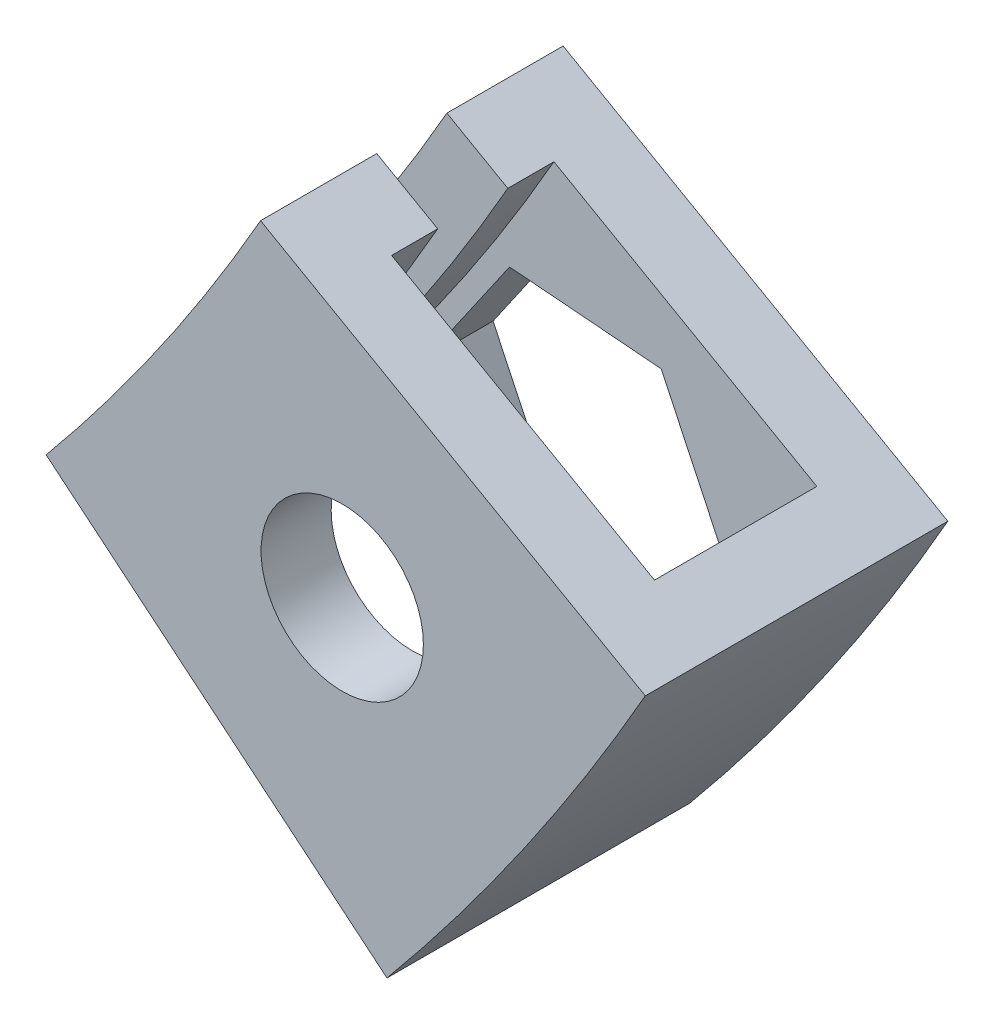
ISO-10303-21;
HEADER;
FILE_DESCRIPTION(('STEP AP214'),'2;1');
FILE_NAME('part.step','',(''),(''),'','','');
FILE_SCHEMA(('AUTOMOTIVE_DESIGN { 1 0 10303 214 1 1 1 1 }'));
ENDSEC;
DATA;
#1=APPLICATION_CONTEXT('core data for automotive mechanical design processes');
#2=APPLICATION_PROTOCOL_DEFINITION('international standard','automotive_design',2000,#1);
#3=PRODUCT_CONTEXT('',#1,'mechanical');
#4=PRODUCT('Part','Part','',(#3));
#5=PRODUCT_RELATED_PRODUCT_CATEGORY('part','',(#4));
#6=PRODUCT_DEFINITION_FORMATION('','',#4);
#7=PRODUCT_DEFINITION_CONTEXT('part definition',#1,'design');
#8=PRODUCT_DEFINITION('design','',#6,#7);
#9=PRODUCT_DEFINITION_SHAPE('','',#8);
#10=(LENGTH_UNIT() NAMED_UNIT(*) SI_UNIT(.MILLI.,.METRE.));
#11=(NAMED_UNIT(*) PLANE_ANGLE_UNIT() SI_UNIT($,.RADIAN.));
#12=(NAMED_UNIT(*) SI_UNIT($,.STERADIAN.) SOLID_ANGLE_UNIT());
#13=UNCERTAINTY_MEASURE_WITH_UNIT(LENGTH_MEASURE(1.E-05),#10,'distance_accuracy_value','');
#14=(GEOMETRIC_REPRESENTATION_CONTEXT(3) GLOBAL_UNCERTAINTY_ASSIGNED_CONTEXT((#13)) GLOBAL_UNIT_ASSIGNED_CONTEXT((#10,
#11,#12)) REPRESENTATION_CONTEXT('',''));
#15=CARTESIAN_POINT('',(0.,0.,0.));
#16=DIRECTION('',(0.,0.,1.));
#17=DIRECTION('',(1.,0.,0.));
#18=AXIS2_PLACEMENT_3D('',#15,#16,#17);
#19=CARTESIAN_POINT('',(85.0871323608312,-48.4714919474364,-10.025));
#20=DIRECTION('',(0.,0.,-1.));
#21=DIRECTION('',(-1.,0.,0.));
#22=AXIS2_PLACEMENT_3D('',#19,#20,#21);
#23=PLANE('',#22);
#24=CARTESIAN_POINT('',(0.,0.,-10.025));
#25=DIRECTION('',(0.,0.,-1.));
#26=DIRECTION('',(-1.,0.,0.));
#27=AXIS2_PLACEMENT_3D('',#24,#25,#26);
#28=CIRCLE('',#27,97.925);
#29=CARTESIAN_POINT('',(85.0871323608312,-48.4714919474364,-10.025));
#30=VERTEX_POINT('',#29);
#31=CARTESIAN_POINT('',(75.3774813850529,-62.5103265472674,-10.025));
#32=VERTEX_POINT('',#31);
#33=EDGE_CURVE('E298',#30,#32,#28,.T.);
#34=ORIENTED_EDGE('',*,*,#33,.F.);
#35=DIRECTION('',(0.868901019768509,-0.494985876409868,0.));
#36=VECTOR('',#35,1.);
#37=CARTESIAN_POINT('',(85.0871323608312,-48.4714919474364,-10.025));
#38=LINE('',#37,#36);
#39=CARTESIAN_POINT('',(102.50859780719,-58.3959587694542,-10.025));
#40=VERTEX_POINT('',#39);
#41=EDGE_CURVE('E274',#30,#40,#38,.T.);
#42=ORIENTED_EDGE('',*,*,#41,.T.);
#43=CARTESIAN_POINT('',(0.,0.,-10.025));
#44=DIRECTION('',(0.,0.,-1.));
#45=DIRECTION('',(-1.,0.,0.));
#46=AXIS2_PLACEMENT_3D('',#43,#44,#45);
#47=CIRCLE('',#46,117.975);
#48=CARTESIAN_POINT('',(90.8109100475018,-75.3092241451506,-10.025));
#49=VERTEX_POINT('',#48);
#50=EDGE_CURVE('E48',#40,#49,#47,.T.);
#51=ORIENTED_EDGE('',*,*,#50,.T.);
#52=DIRECTION('',(0.769747065458799,-0.63834900737572,0.));
#53=VECTOR('',#52,1.);
#54=CARTESIAN_POINT('',(75.3774813850529,-62.5103265472674,-10.025));
#55=LINE('',#54,#53);
#56=EDGE_CURVE('E238',#32,#49,#55,.T.);
#57=ORIENTED_EDGE('',*,*,#56,.F.);
#58=EDGE_LOOP('',(#34,#42,#51,#57));
#59=FACE_BOUND('',#58,.T.);
#60=DIRECTION('',(0.996681831054821,-0.0813961156641359,0.));
#61=VECTOR('',#60,1.);
#62=CARTESIAN_POINT('',(84.8632577827189,-67.0741027508914,-10.025));
#63=LINE('',#62,#61);
#64=CARTESIAN_POINT('',(84.8632577827189,-67.0741027508914,-10.025));
#65=VERTEX_POINT('',#64);
#66=CARTESIAN_POINT('',(91.7327951237355,-67.6351179500716,-10.025));
#67=VERTEX_POINT('',#66);
#68=EDGE_CURVE('E192',#65,#67,#63,.T.);
#69=ORIENTED_EDGE('',*,*,#68,.T.);
#70=DIRECTION('',(0.568832019461929,0.822453727351797,0.));
#71=VECTOR('',#70,1.);
#72=CARTESIAN_POINT('',(91.7327951237355,-67.6351179500716,-10.025));
#73=LINE('',#72,#71);
#74=CARTESIAN_POINT('',(95.6534172086431,-61.9664317000955,-10.025));
#75=VERTEX_POINT('',#74);
#76=EDGE_CURVE('E194',#67,#75,#73,.T.);
#77=ORIENTED_EDGE('',*,*,#76,.T.);
#78=DIRECTION('',(-0.427849811592891,0.903849843015933,0.));
#79=VECTOR('',#78,1.);
#80=CARTESIAN_POINT('',(95.6534172086431,-61.9664317000955,-10.025));
#81=LINE('',#80,#79);
#82=CARTESIAN_POINT('',(92.704501952534,-55.7367302509391,-10.025));
#83=VERTEX_POINT('',#82);
#84=EDGE_CURVE('E185',#75,#83,#81,.T.);
#85=ORIENTED_EDGE('',*,*,#84,.T.);
#86=DIRECTION('',(-0.996681831054821,0.0813961156641372,0.));
#87=VECTOR('',#86,1.);
#88=CARTESIAN_POINT('',(92.704501952534,-55.7367302509391,-10.025));
#89=LINE('',#88,#87);
#90=CARTESIAN_POINT('',(85.8349646115173,-55.1757150517589,-10.025));
#91=VERTEX_POINT('',#90);
#92=EDGE_CURVE('E55',#83,#91,#89,.T.);
#93=ORIENTED_EDGE('',*,*,#92,.T.);
#94=DIRECTION('',(-0.568832019461928,-0.822453727351798,0.));
#95=VECTOR('',#94,1.);
#96=CARTESIAN_POINT('',(85.8349646115173,-55.1757150517589,-10.025));
#97=LINE('',#96,#95);
#98=CARTESIAN_POINT('',(81.9143425266098,-60.8444013017351,-10.025));
#99=VERTEX_POINT('',#98);
#100=EDGE_CURVE('E174',#91,#99,#97,.T.);
#101=ORIENTED_EDGE('',*,*,#100,.T.);
#102=DIRECTION('',(0.427849811592891,-0.903849843015933,0.));
#103=VECTOR('',#102,1.);
#104=CARTESIAN_POINT('',(81.9143425266098,-60.8444013017351,-10.025));
#105=LINE('',#104,#103);
#106=EDGE_CURVE('E179',#99,#65,#105,.T.);
#107=ORIENTED_EDGE('',*,*,#106,.T.);
#108=EDGE_LOOP('',(#69,#77,#85,#93,#101,#107));
#109=FACE_BOUND('',#108,.T.);
#110=ADVANCED_FACE('F39',(#59,#109),#23,.T.);
#111=CARTESIAN_POINT('',(99.7498370694248,-56.8243786118529,-6.85));
#112=DIRECTION('',(0.,0.,1.));
#113=DIRECTION('',(1.,0.,0.));
#114=AXIS2_PLACEMENT_3D('',#111,#112,#113);
#115=PLANE('',#114);
#116=CARTESIAN_POINT('',(0.,0.,-6.85000000000001));
#117=DIRECTION('',(0.,0.,-1.));
#118=DIRECTION('',(-1.,0.,0.));
#119=AXIS2_PLACEMENT_3D('',#116,#117,#118);
#120=CIRCLE('',#119,114.8);
#121=CARTESIAN_POINT('',(99.7498370694248,-56.8243786118529,-6.85));
#122=VERTEX_POINT('',#121);
#123=CARTESIAN_POINT('',(88.3669631146701,-73.2824660467327,-6.85));
#124=VERTEX_POINT('',#123);
#125=EDGE_CURVE('E290',#122,#124,#120,.T.);
#126=ORIENTED_EDGE('',*,*,#125,.F.);
#127=DIRECTION('',(-0.868901019768509,0.494985876409869,0.));
#128=VECTOR('',#127,1.);
#129=CARTESIAN_POINT('',(99.7498370694248,-56.8243786118529,-6.85));
#130=LINE('',#129,#128);
#131=CARTESIAN_POINT('',(87.8458930985962,-50.0430721050377,-6.85));
#132=VERTEX_POINT('',#131);
#133=EDGE_CURVE('E262',#122,#132,#130,.T.);
#134=ORIENTED_EDGE('',*,*,#133,.T.);
#135=CARTESIAN_POINT('',(0.,0.,-6.85000000000001));
#136=DIRECTION('',(0.,0.,-1.));
#137=DIRECTION('',(-1.,0.,0.));
#138=AXIS2_PLACEMENT_3D('',#135,#136,#137);
#139=CIRCLE('',#138,101.1);
#140=CARTESIAN_POINT('',(77.8214283178846,-64.5370846456853,-6.85));
#141=VERTEX_POINT('',#140);
#142=EDGE_CURVE('E292',#132,#141,#139,.T.);
#143=ORIENTED_EDGE('',*,*,#142,.T.);
#144=DIRECTION('',(-0.769747065458799,0.638349007375721,0.));
#145=VECTOR('',#144,1.);
#146=CARTESIAN_POINT('',(88.3669631146701,-73.2824660467327,-6.85));
#147=LINE('',#146,#145);
#148=EDGE_CURVE('E226',#124,#141,#147,.T.);
#149=ORIENTED_EDGE('',*,*,#148,.F.);
#150=EDGE_LOOP('',(#126,#134,#143,#149));
#151=FACE_BOUND('',#150,.T.);
#152=DIRECTION('',(-0.427849811592891,0.903849843015933,0.));
#153=VECTOR('',#152,1.);
#154=CARTESIAN_POINT('',(95.6534172086431,-61.9664317000955,-6.85));
#155=LINE('',#154,#153);
#156=CARTESIAN_POINT('',(95.6534172086431,-61.9664317000955,-6.85));
#157=VERTEX_POINT('',#156);
#158=CARTESIAN_POINT('',(92.704501952534,-55.7367302509391,-6.85));
#159=VERTEX_POINT('',#158);
#160=EDGE_CURVE('E187',#157,#159,#155,.T.);
#161=ORIENTED_EDGE('',*,*,#160,.F.);
#162=DIRECTION('',(0.568832019461929,0.822453727351797,0.));
#163=VECTOR('',#162,1.);
#164=CARTESIAN_POINT('',(91.7327951237355,-67.6351179500716,-6.85));
#165=LINE('',#164,#163);
#166=CARTESIAN_POINT('',(91.7327951237355,-67.6351179500716,-6.85));
#167=VERTEX_POINT('',#166);
#168=EDGE_CURVE('E63',#167,#157,#165,.T.);
#169=ORIENTED_EDGE('',*,*,#168,.F.);
#170=DIRECTION('',(0.996681831054821,-0.0813961156641359,0.));
#171=VECTOR('',#170,1.);
#172=CARTESIAN_POINT('',(84.8632577827189,-67.0741027508914,-6.85));
#173=LINE('',#172,#171);
#174=CARTESIAN_POINT('',(84.8632577827189,-67.0741027508914,-6.85));
#175=VERTEX_POINT('',#174);
#176=EDGE_CURVE('E509',#175,#167,#173,.T.);
#177=ORIENTED_EDGE('',*,*,#176,.F.);
#178=DIRECTION('',(0.427849811592891,-0.903849843015933,0.));
#179=VECTOR('',#178,1.);
#180=CARTESIAN_POINT('',(81.9143425266098,-60.8444013017351,-6.85));
#181=LINE('',#180,#179);
#182=CARTESIAN_POINT('',(81.9143425266098,-60.8444013017351,-6.85));
#183=VERTEX_POINT('',#182);
#184=EDGE_CURVE('E504',#183,#175,#181,.T.);
#185=ORIENTED_EDGE('',*,*,#184,.F.);
#186=DIRECTION('',(-0.568832019461928,-0.822453727351798,0.));
#187=VECTOR('',#186,1.);
#188=CARTESIAN_POINT('',(85.8349646115173,-55.1757150517589,-6.85));
#189=LINE('',#188,#187);
#190=CARTESIAN_POINT('',(85.8349646115173,-55.1757150517589,-6.85));
#191=VERTEX_POINT('',#190);
#192=EDGE_CURVE('E502',#191,#183,#189,.T.);
#193=ORIENTED_EDGE('',*,*,#192,.F.);
#194=DIRECTION('',(-0.996681831054821,0.0813961156641373,0.));
#195=VECTOR('',#194,1.);
#196=CARTESIAN_POINT('',(92.704501952534,-55.7367302509391,-6.85));
#197=LINE('',#196,#195);
#198=EDGE_CURVE('E166',#159,#191,#197,.T.);
#199=ORIENTED_EDGE('',*,*,#198,.F.);
#200=EDGE_LOOP('',(#161,#169,#177,#185,#193,#199));
#201=FACE_BOUND('',#200,.T.);
#202=ADVANCED_FACE('F335',(#151,#201),#115,.T.);
#203=CARTESIAN_POINT('',(102.50859780719,-58.3959587694542,3.675));
#204=DIRECTION('',(0.,0.,1.));
#205=DIRECTION('',(1.,0.,0.));
#206=AXIS2_PLACEMENT_3D('',#203,#204,#205);
#207=PLANE('',#206);
#208=CARTESIAN_POINT('',(88.7838798676264,-61.4054165009153,3.675));
#209=DIRECTION('',(0.,0.,1.));
#210=DIRECTION('',(1.,0.,0.));
#211=AXIS2_PLACEMENT_3D('',#208,#209,#210);
#212=CIRCLE('',#211,3.67500000000003);
#213=CARTESIAN_POINT('',(92.4588798676265,-61.4054165009153,3.675));
#214=VERTEX_POINT('',#213);
#215=EDGE_CURVE('E205',#214,#214,#212,.F.);
#216=ORIENTED_EDGE('',*,*,#215,.T.);
#217=EDGE_LOOP('',(#216));
#218=FACE_BOUND('',#217,.T.);
#219=CARTESIAN_POINT('',(0.,0.,3.67499999999999));
#220=DIRECTION('',(0.,0.,-1.));
#221=DIRECTION('',(-1.,0.,0.));
#222=AXIS2_PLACEMENT_3D('',#219,#220,#221);
#223=CIRCLE('',#222,117.975);
#224=CARTESIAN_POINT('',(102.50859780719,-58.3959587694542,3.675));
#225=VERTEX_POINT('',#224);
#226=CARTESIAN_POINT('',(90.8109100475018,-75.3092241451506,3.675));
#227=VERTEX_POINT('',#226);
#228=EDGE_CURVE('E11',#225,#227,#223,.T.);
#229=ORIENTED_EDGE('',*,*,#228,.F.);
#230=DIRECTION('',(-0.868901019768509,0.494985876409868,0.));
#231=VECTOR('',#230,1.);
#232=CARTESIAN_POINT('',(102.50859780719,-58.3959587694542,3.675));
#233=LINE('',#232,#231);
#234=CARTESIAN_POINT('',(85.0871323608312,-48.4714919474364,3.675));
#235=VERTEX_POINT('',#234);
#236=EDGE_CURVE('E244',#225,#235,#233,.T.);
#237=ORIENTED_EDGE('',*,*,#236,.T.);
#238=CARTESIAN_POINT('',(0.,0.,3.67499999999999));
#239=DIRECTION('',(0.,0.,-1.));
#240=DIRECTION('',(-1.,0.,0.));
#241=AXIS2_PLACEMENT_3D('',#238,#239,#240);
#242=CIRCLE('',#241,97.925);
#243=CARTESIAN_POINT('',(75.3774813850529,-62.5103265472674,3.675));
#244=VERTEX_POINT('',#243);
#245=EDGE_CURVE('E280',#235,#244,#242,.T.);
#246=ORIENTED_EDGE('',*,*,#245,.T.);
#247=DIRECTION('',(-0.769747065458799,0.63834900737572,0.));
#248=VECTOR('',#247,1.);
#249=CARTESIAN_POINT('',(90.8109100475018,-75.3092241451506,3.675));
#250=LINE('',#249,#248);
#251=EDGE_CURVE('E208',#227,#244,#250,.T.);
#252=ORIENTED_EDGE('',*,*,#251,.F.);
#253=EDGE_LOOP('',(#229,#237,#246,#252));
#254=FACE_BOUND('',#253,.T.);
#255=ADVANCED_FACE('F312',(#218,#254),#207,.T.);
#256=CARTESIAN_POINT('',(0.,0.,-16.4732371867691));
#257=DIRECTION('',(0.,0.,-1.));
#258=DIRECTION('',(-1.,0.,0.));
#259=AXIS2_PLACEMENT_3D('',#256,#257,#258);
#260=CYLINDRICAL_SURFACE('',#259,117.975);
#261=ORIENTED_EDGE('',*,*,#50,.F.);
#262=DIRECTION('',(0.,0.,1.));
#263=VECTOR('',#262,1.);
#264=CARTESIAN_POINT('',(102.50859780719,-58.3959587694542,-10.025));
#265=LINE('',#264,#263);
#266=EDGE_CURVE('E277',#40,#225,#265,.T.);
#267=ORIENTED_EDGE('',*,*,#266,.T.);
#268=ORIENTED_EDGE('',*,*,#228,.T.);
#269=DIRECTION('',(0.,0.,1.));
#270=VECTOR('',#269,1.);
#271=CARTESIAN_POINT('',(90.8109100475018,-75.3092241451506,-10.025));
#272=LINE('',#271,#270);
#273=EDGE_CURVE('E241',#49,#227,#272,.T.);
#274=ORIENTED_EDGE('',*,*,#273,.F.);
#275=EDGE_LOOP('',(#261,#267,#268,#274));
#276=FACE_BOUND('',#275,.T.);
#277=ADVANCED_FACE('F41',(#276),#260,.T.);
#278=CARTESIAN_POINT('',(0.,0.,-16.4732371867691));
#279=DIRECTION('',(0.,0.,-1.));
#280=DIRECTION('',(-1.,0.,0.));
#281=AXIS2_PLACEMENT_3D('',#278,#279,#280);
#282=CYLINDRICAL_SURFACE('',#281,97.925);
#283=CARTESIAN_POINT('',(0.,0.,-4.76250000000001));
#284=DIRECTION('',(0.,0.,-1.));
#285=DIRECTION('',(-1.,0.,0.));
#286=AXIS2_PLACEMENT_3D('',#283,#284,#285);
#287=CIRCLE('',#286,97.925);
#288=CARTESIAN_POINT('',(85.0871323608312,-48.4714919474364,-4.7625));
#289=VERTEX_POINT('',#288);
#290=CARTESIAN_POINT('',(75.3774813850529,-62.5103265472674,-4.7625));
#291=VERTEX_POINT('',#290);
#292=EDGE_CURVE('E296',#289,#291,#287,.T.);
#293=ORIENTED_EDGE('',*,*,#292,.F.);
#294=DIRECTION('',(0.,0.,-1.));
#295=VECTOR('',#294,1.);
#296=CARTESIAN_POINT('',(85.0871323608312,-48.4714919474364,-4.7625));
#297=LINE('',#296,#295);
#298=EDGE_CURVE('E271',#289,#30,#297,.T.);
#299=ORIENTED_EDGE('',*,*,#298,.T.);
#300=ORIENTED_EDGE('',*,*,#33,.T.);
#301=DIRECTION('',(0.,0.,-1.));
#302=VECTOR('',#301,1.);
#303=CARTESIAN_POINT('',(75.3774813850529,-62.5103265472674,-4.7625));
#304=LINE('',#303,#302);
#305=EDGE_CURVE('E235',#291,#32,#304,.T.);
#306=ORIENTED_EDGE('',*,*,#305,.F.);
#307=EDGE_LOOP('',(#293,#299,#300,#306));
#308=FACE_BOUND('',#307,.T.);
#309=ADVANCED_FACE('F346',(#308),#282,.F.);
#310=CARTESIAN_POINT('',(87.8458930985962,-50.0430721050377,-4.7625));
#311=DIRECTION('',(0.,0.,1.));
#312=DIRECTION('',(1.,0.,0.));
#313=AXIS2_PLACEMENT_3D('',#310,#311,#312);
#314=PLANE('',#313);
#315=CARTESIAN_POINT('',(0.,0.,-4.76250000000001));
#316=DIRECTION('',(0.,0.,-1.));
#317=DIRECTION('',(-1.,0.,0.));
#318=AXIS2_PLACEMENT_3D('',#315,#316,#317);
#319=CIRCLE('',#318,101.1);
#320=CARTESIAN_POINT('',(87.8458930985962,-50.0430721050377,-4.7625));
#321=VERTEX_POINT('',#320);
#322=CARTESIAN_POINT('',(77.8214283178846,-64.5370846456853,-4.7625));
#323=VERTEX_POINT('',#322);
#324=EDGE_CURVE('E294',#321,#323,#319,.T.);
#325=ORIENTED_EDGE('',*,*,#324,.F.);
#326=DIRECTION('',(-0.868901019768509,0.494985876409868,0.));
#327=VECTOR('',#326,1.);
#328=CARTESIAN_POINT('',(87.8458930985962,-50.0430721050377,-4.7625));
#329=LINE('',#328,#327);
#330=EDGE_CURVE('E268',#321,#289,#329,.T.);
#331=ORIENTED_EDGE('',*,*,#330,.T.);
#332=ORIENTED_EDGE('',*,*,#292,.T.);
#333=DIRECTION('',(-0.769747065458799,0.63834900737572,0.));
#334=VECTOR('',#333,1.);
#335=CARTESIAN_POINT('',(77.8214283178846,-64.5370846456853,-4.7625));
#336=LINE('',#335,#334);
#337=EDGE_CURVE('E232',#323,#291,#336,.T.);
#338=ORIENTED_EDGE('',*,*,#337,.F.);
#339=EDGE_LOOP('',(#325,#331,#332,#338));
#340=FACE_BOUND('',#339,.T.);
#341=ADVANCED_FACE('F343',(#340),#314,.T.);
#342=CARTESIAN_POINT('',(0.,0.,-16.4732371867691));
#343=DIRECTION('',(0.,0.,-1.));
#344=DIRECTION('',(-1.,0.,0.));
#345=AXIS2_PLACEMENT_3D('',#342,#343,#344);
#346=CYLINDRICAL_SURFACE('',#345,101.1);
#347=ORIENTED_EDGE('',*,*,#142,.F.);
#348=DIRECTION('',(0.,0.,1.));
#349=VECTOR('',#348,1.);
#350=CARTESIAN_POINT('',(87.8458930985962,-50.0430721050377,-6.85));
#351=LINE('',#350,#349);
#352=EDGE_CURVE('E265',#132,#321,#351,.T.);
#353=ORIENTED_EDGE('',*,*,#352,.T.);
#354=ORIENTED_EDGE('',*,*,#324,.T.);
#355=DIRECTION('',(0.,0.,1.));
#356=VECTOR('',#355,1.);
#357=CARTESIAN_POINT('',(77.8214283178846,-64.5370846456853,-6.85));
#358=LINE('',#357,#356);
#359=EDGE_CURVE('E229',#141,#323,#358,.T.);
#360=ORIENTED_EDGE('',*,*,#359,.F.);
#361=EDGE_LOOP('',(#347,#353,#354,#360));
#362=FACE_BOUND('',#361,.T.);
#363=ADVANCED_FACE('F339',(#362),#346,.T.);
#364=CARTESIAN_POINT('',(0.,0.,-16.4732371867691));
#365=DIRECTION('',(0.,0.,-1.));
#366=DIRECTION('',(-1.,0.,0.));
#367=AXIS2_PLACEMENT_3D('',#364,#365,#366);
#368=CYLINDRICAL_SURFACE('',#367,114.8);
#369=CARTESIAN_POINT('',(0.,0.,0.499999999999987));
#370=DIRECTION('',(0.,0.,-1.));
#371=DIRECTION('',(-1.,0.,0.));
#372=AXIS2_PLACEMENT_3D('',#369,#370,#371);
#373=CIRCLE('',#372,114.8);
#374=CARTESIAN_POINT('',(99.7498370694248,-56.8243786118529,0.5));
#375=VERTEX_POINT('',#374);
#376=CARTESIAN_POINT('',(88.3669631146701,-73.2824660467327,0.5));
#377=VERTEX_POINT('',#376);
#378=EDGE_CURVE('E288',#375,#377,#373,.T.);
#379=ORIENTED_EDGE('',*,*,#378,.F.);
#380=DIRECTION('',(0.,0.,-1.));
#381=VECTOR('',#380,1.);
#382=CARTESIAN_POINT('',(99.7498370694248,-56.8243786118529,0.5));
#383=LINE('',#382,#381);
#384=EDGE_CURVE('E259',#375,#122,#383,.T.);
#385=ORIENTED_EDGE('',*,*,#384,.T.);
#386=ORIENTED_EDGE('',*,*,#125,.T.);
#387=DIRECTION('',(0.,0.,-1.));
#388=VECTOR('',#387,1.);
#389=CARTESIAN_POINT('',(88.3669631146701,-73.2824660467327,0.5));
#390=LINE('',#389,#388);
#391=EDGE_CURVE('E223',#377,#124,#390,.T.);
#392=ORIENTED_EDGE('',*,*,#391,.F.);
#393=EDGE_LOOP('',(#379,#385,#386,#392));
#394=FACE_BOUND('',#393,.T.);
#395=ADVANCED_FACE('F330',(#394),#368,.F.);
#396=CARTESIAN_POINT('',(87.8458930985962,-50.0430721050377,0.499999999999999));
#397=DIRECTION('',(0.,0.,-1.));
#398=DIRECTION('',(-1.,0.,0.));
#399=AXIS2_PLACEMENT_3D('',#396,#397,#398);
#400=PLANE('',#399);
#401=CARTESIAN_POINT('',(88.7838798676264,-61.4054165009153,0.499999999999999));
#402=DIRECTION('',(0.,0.,-1.));
#403=DIRECTION('',(-1.,0.,0.));
#404=AXIS2_PLACEMENT_3D('',#401,#402,#403);
#405=CIRCLE('',#404,3.67500000000003);
#406=CARTESIAN_POINT('',(85.1088798676264,-61.4054165009153,0.499999999999998));
#407=VERTEX_POINT('',#406);
#408=EDGE_CURVE('E43',#407,#407,#405,.F.);
#409=ORIENTED_EDGE('',*,*,#408,.T.);
#410=EDGE_LOOP('',(#409));
#411=FACE_BOUND('',#410,.T.);
#412=CARTESIAN_POINT('',(0.,0.,0.49999999999999));
#413=DIRECTION('',(0.,0.,-1.));
#414=DIRECTION('',(-1.,0.,0.));
#415=AXIS2_PLACEMENT_3D('',#412,#413,#414);
#416=CIRCLE('',#415,101.1);
#417=CARTESIAN_POINT('',(87.8458930985962,-50.0430721050377,0.5));
#418=VERTEX_POINT('',#417);
#419=CARTESIAN_POINT('',(77.8214283178846,-64.5370846456853,0.5));
#420=VERTEX_POINT('',#419);
#421=EDGE_CURVE('E286',#418,#420,#416,.T.);
#422=ORIENTED_EDGE('',*,*,#421,.F.);
#423=DIRECTION('',(0.868901019768509,-0.494985876409869,0.));
#424=VECTOR('',#423,1.);
#425=CARTESIAN_POINT('',(87.8458930985962,-50.0430721050377,0.5));
#426=LINE('',#425,#424);
#427=EDGE_CURVE('E256',#418,#375,#426,.T.);
#428=ORIENTED_EDGE('',*,*,#427,.T.);
#429=ORIENTED_EDGE('',*,*,#378,.T.);
#430=DIRECTION('',(0.769747065458799,-0.638349007375721,0.));
#431=VECTOR('',#430,1.);
#432=CARTESIAN_POINT('',(77.8214283178846,-64.5370846456853,0.5));
#433=LINE('',#432,#431);
#434=EDGE_CURVE('E220',#420,#377,#433,.T.);
#435=ORIENTED_EDGE('',*,*,#434,.F.);
#436=EDGE_LOOP('',(#422,#428,#429,#435));
#437=FACE_BOUND('',#436,.T.);
#438=ADVANCED_FACE('F327',(#411,#437),#400,.T.);
#439=CARTESIAN_POINT('',(0.,0.,-16.4732371867691));
#440=DIRECTION('',(0.,0.,-1.));
#441=DIRECTION('',(-1.,0.,0.));
#442=AXIS2_PLACEMENT_3D('',#439,#440,#441);
#443=CYLINDRICAL_SURFACE('',#442,101.1);
#444=CARTESIAN_POINT('',(0.,0.,-1.58750000000001));
#445=DIRECTION('',(0.,0.,-1.));
#446=DIRECTION('',(-1.,0.,0.));
#447=AXIS2_PLACEMENT_3D('',#444,#445,#446);
#448=CIRCLE('',#447,101.1);
#449=CARTESIAN_POINT('',(87.8458930985962,-50.0430721050377,-1.5875));
#450=VERTEX_POINT('',#449);
#451=CARTESIAN_POINT('',(77.8214283178846,-64.5370846456853,-1.5875));
#452=VERTEX_POINT('',#451);
#453=EDGE_CURVE('E284',#450,#452,#448,.T.);
#454=ORIENTED_EDGE('',*,*,#453,.F.);
#455=DIRECTION('',(0.,0.,1.));
#456=VECTOR('',#455,1.);
#457=CARTESIAN_POINT('',(87.8458930985962,-50.0430721050377,-1.5875));
#458=LINE('',#457,#456);
#459=EDGE_CURVE('E253',#450,#418,#458,.T.);
#460=ORIENTED_EDGE('',*,*,#459,.T.);
#461=ORIENTED_EDGE('',*,*,#421,.T.);
#462=DIRECTION('',(0.,0.,1.));
#463=VECTOR('',#462,1.);
#464=CARTESIAN_POINT('',(77.8214283178846,-64.5370846456853,-1.5875));
#465=LINE('',#464,#463);
#466=EDGE_CURVE('E217',#452,#420,#465,.T.);
#467=ORIENTED_EDGE('',*,*,#466,.F.);
#468=EDGE_LOOP('',(#454,#460,#461,#467));
#469=FACE_BOUND('',#468,.T.);
#470=ADVANCED_FACE('F322',(#469),#443,.T.);
#471=CARTESIAN_POINT('',(85.0871323608312,-48.4714919474364,-1.5875));
#472=DIRECTION('',(0.,0.,-1.));
#473=DIRECTION('',(-1.,0.,0.));
#474=AXIS2_PLACEMENT_3D('',#471,#472,#473);
#475=PLANE('',#474);
#476=CARTESIAN_POINT('',(0.,0.,-1.58750000000001));
#477=DIRECTION('',(0.,0.,-1.));
#478=DIRECTION('',(-1.,0.,0.));
#479=AXIS2_PLACEMENT_3D('',#476,#477,#478);
#480=CIRCLE('',#479,97.925);
#481=CARTESIAN_POINT('',(85.0871323608312,-48.4714919474364,-1.5875));
#482=VERTEX_POINT('',#481);
#483=CARTESIAN_POINT('',(75.3774813850529,-62.5103265472674,-1.5875));
#484=VERTEX_POINT('',#483);
#485=EDGE_CURVE('E282',#482,#484,#480,.T.);
#486=ORIENTED_EDGE('',*,*,#485,.F.);
#487=DIRECTION('',(0.868901019768509,-0.494985876409868,0.));
#488=VECTOR('',#487,1.);
#489=CARTESIAN_POINT('',(85.0871323608312,-48.4714919474364,-1.5875));
#490=LINE('',#489,#488);
#491=EDGE_CURVE('E250',#482,#450,#490,.T.);
#492=ORIENTED_EDGE('',*,*,#491,.T.);
#493=ORIENTED_EDGE('',*,*,#453,.T.);
#494=DIRECTION('',(0.769747065458799,-0.63834900737572,0.));
#495=VECTOR('',#494,1.);
#496=CARTESIAN_POINT('',(75.3774813850529,-62.5103265472674,-1.5875));
#497=LINE('',#496,#495);
#498=EDGE_CURVE('E214',#484,#452,#497,.T.);
#499=ORIENTED_EDGE('',*,*,#498,.F.);
#500=EDGE_LOOP('',(#486,#492,#493,#499));
#501=FACE_BOUND('',#500,.T.);
#502=ADVANCED_FACE('F318',(#501),#475,.T.);
#503=CARTESIAN_POINT('',(0.,0.,-16.4732371867691));
#504=DIRECTION('',(0.,0.,-1.));
#505=DIRECTION('',(-1.,0.,0.));
#506=AXIS2_PLACEMENT_3D('',#503,#504,#505);
#507=CYLINDRICAL_SURFACE('',#506,97.925);
#508=DIRECTION('',(0.,0.,-1.));
#509=VECTOR('',#508,1.);
#510=CARTESIAN_POINT('',(85.0871323608312,-48.4714919474364,3.675));
#511=LINE('',#510,#509);
#512=EDGE_CURVE('E247',#235,#482,#511,.T.);
#513=ORIENTED_EDGE('',*,*,#512,.T.);
#514=ORIENTED_EDGE('',*,*,#485,.T.);
#515=DIRECTION('',(0.,0.,-1.));
#516=VECTOR('',#515,1.);
#517=CARTESIAN_POINT('',(75.3774813850529,-62.5103265472674,3.675));
#518=LINE('',#517,#516);
#519=EDGE_CURVE('E211',#244,#484,#518,.T.);
#520=ORIENTED_EDGE('',*,*,#519,.F.);
#521=ORIENTED_EDGE('',*,*,#245,.F.);
#522=EDGE_LOOP('',(#513,#514,#520,#521));
#523=FACE_BOUND('',#522,.T.);
#524=ADVANCED_FACE('F350',(#523),#507,.F.);
#525=CARTESIAN_POINT('',(0.,0.,0.));
#526=DIRECTION('',(-0.494985876409868,-0.868901019768509,0.));
#527=DIRECTION('',(0.868901019768509,-0.494985876409868,0.));
#528=AXIS2_PLACEMENT_3D('',#525,#526,#527);
#529=PLANE('',#528);
#530=ORIENTED_EDGE('',*,*,#236,.F.);
#531=ORIENTED_EDGE('',*,*,#266,.F.);
#532=ORIENTED_EDGE('',*,*,#41,.F.);
#533=ORIENTED_EDGE('',*,*,#298,.F.);
#534=ORIENTED_EDGE('',*,*,#330,.F.);
#535=ORIENTED_EDGE('',*,*,#352,.F.);
#536=ORIENTED_EDGE('',*,*,#133,.F.);
#537=ORIENTED_EDGE('',*,*,#384,.F.);
#538=ORIENTED_EDGE('',*,*,#427,.F.);
#539=ORIENTED_EDGE('',*,*,#459,.F.);
#540=ORIENTED_EDGE('',*,*,#491,.F.);
#541=ORIENTED_EDGE('',*,*,#512,.F.);
#542=EDGE_LOOP('',(#530,#531,#532,#533,#534,#535,#536,#537,#538,#539,#540,#541));
#543=FACE_BOUND('',#542,.T.);
#544=ADVANCED_FACE('F348',(#543),#529,.F.);
#545=CARTESIAN_POINT('',(0.,0.,0.));
#546=DIRECTION('',(-0.63834900737572,-0.769747065458799,0.));
#547=DIRECTION('',(0.769747065458799,-0.63834900737572,0.));
#548=AXIS2_PLACEMENT_3D('',#545,#546,#547);
#549=PLANE('',#548);
#550=ORIENTED_EDGE('',*,*,#251,.T.);
#551=ORIENTED_EDGE('',*,*,#519,.T.);
#552=ORIENTED_EDGE('',*,*,#498,.T.);
#553=ORIENTED_EDGE('',*,*,#466,.T.);
#554=ORIENTED_EDGE('',*,*,#434,.T.);
#555=ORIENTED_EDGE('',*,*,#391,.T.);
#556=ORIENTED_EDGE('',*,*,#148,.T.);
#557=ORIENTED_EDGE('',*,*,#359,.T.);
#558=ORIENTED_EDGE('',*,*,#337,.T.);
#559=ORIENTED_EDGE('',*,*,#305,.T.);
#560=ORIENTED_EDGE('',*,*,#56,.T.);
#561=ORIENTED_EDGE('',*,*,#273,.T.);
#562=EDGE_LOOP('',(#550,#551,#552,#553,#554,#555,#556,#557,#558,#559,#560,#561));
#563=FACE_BOUND('',#562,.T.);
#564=ADVANCED_FACE('F307',(#563),#549,.T.);
#565=CARTESIAN_POINT('',(88.7838798676264,-61.4054165009153,-10.025));
#566=DIRECTION('',(0.,0.,1.));
#567=DIRECTION('',(1.,0.,0.));
#568=AXIS2_PLACEMENT_3D('',#565,#566,#567);
#569=CYLINDRICAL_SURFACE('',#568,3.67500000000003);
#570=ORIENTED_EDGE('',*,*,#215,.F.);
#571=EDGE_LOOP('',(#570));
#572=FACE_BOUND('',#571,.T.);
#573=ORIENTED_EDGE('',*,*,#408,.F.);
#574=EDGE_LOOP('',(#573));
#575=FACE_BOUND('',#574,.T.);
#576=ADVANCED_FACE('F406',(#572,#575),#569,.F.);
#577=CARTESIAN_POINT('',(91.7327951237355,-67.6351179500716,3.676));
#578=DIRECTION('',(-0.822453727351797,0.568832019461929,0.));
#579=DIRECTION('',(-0.568832019461929,-0.822453727351797,0.));
#580=AXIS2_PLACEMENT_3D('',#577,#578,#579);
#581=PLANE('',#580);
#582=ORIENTED_EDGE('',*,*,#168,.T.);
#583=DIRECTION('',(0.,0.,-1.));
#584=VECTOR('',#583,1.);
#585=CARTESIAN_POINT('',(95.6534172086431,-61.9664317000955,3.676));
#586=LINE('',#585,#584);
#587=EDGE_CURVE('E196',#157,#75,#586,.T.);
#588=ORIENTED_EDGE('',*,*,#587,.T.);
#589=ORIENTED_EDGE('',*,*,#76,.F.);
#590=DIRECTION('',(0.,0.,-1.));
#591=VECTOR('',#590,1.);
#592=CARTESIAN_POINT('',(91.7327951237355,-67.6351179500716,3.676));
#593=LINE('',#592,#591);
#594=EDGE_CURVE('E198',#167,#67,#593,.T.);
#595=ORIENTED_EDGE('',*,*,#594,.F.);
#596=EDGE_LOOP('',(#582,#588,#589,#595));
#597=FACE_BOUND('',#596,.T.);
#598=ADVANCED_FACE('F429',(#597),#581,.T.);
#599=CARTESIAN_POINT('',(84.8632577827189,-67.0741027508914,3.676));
#600=DIRECTION('',(0.0813961156641359,0.996681831054821,0.));
#601=DIRECTION('',(-0.996681831054821,0.0813961156641359,0.));
#602=AXIS2_PLACEMENT_3D('',#599,#600,#601);
#603=PLANE('',#602);
#604=ORIENTED_EDGE('',*,*,#176,.T.);
#605=ORIENTED_EDGE('',*,*,#594,.T.);
#606=ORIENTED_EDGE('',*,*,#68,.F.);
#607=DIRECTION('',(0.,0.,-1.));
#608=VECTOR('',#607,1.);
#609=CARTESIAN_POINT('',(84.8632577827189,-67.0741027508914,3.676));
#610=LINE('',#609,#608);
#611=EDGE_CURVE('E200',#175,#65,#610,.T.);
#612=ORIENTED_EDGE('',*,*,#611,.F.);
#613=EDGE_LOOP('',(#604,#605,#606,#612));
#614=FACE_BOUND('',#613,.T.);
#615=ADVANCED_FACE('F450',(#614),#603,.T.);
#616=CARTESIAN_POINT('',(81.9143425266098,-60.8444013017351,3.676));
#617=DIRECTION('',(0.903849843015933,0.427849811592891,0.));
#618=DIRECTION('',(-0.427849811592891,0.903849843015933,0.));
#619=AXIS2_PLACEMENT_3D('',#616,#617,#618);
#620=PLANE('',#619);
#621=ORIENTED_EDGE('',*,*,#184,.T.);
#622=ORIENTED_EDGE('',*,*,#611,.T.);
#623=ORIENTED_EDGE('',*,*,#106,.F.);
#624=DIRECTION('',(0.,0.,-1.));
#625=VECTOR('',#624,1.);
#626=CARTESIAN_POINT('',(81.9143425266098,-60.8444013017351,3.676));
#627=LINE('',#626,#625);
#628=EDGE_CURVE('E171',#183,#99,#627,.T.);
#629=ORIENTED_EDGE('',*,*,#628,.F.);
#630=EDGE_LOOP('',(#621,#622,#623,#629));
#631=FACE_BOUND('',#630,.T.);
#632=ADVANCED_FACE('F459',(#631),#620,.T.);
#633=CARTESIAN_POINT('',(85.8349646115173,-55.1757150517589,3.676));
#634=DIRECTION('',(0.822453727351798,-0.568832019461928,0.));
#635=DIRECTION('',(0.568832019461928,0.822453727351798,0.));
#636=AXIS2_PLACEMENT_3D('',#633,#634,#635);
#637=PLANE('',#636);
#638=ORIENTED_EDGE('',*,*,#192,.T.);
#639=ORIENTED_EDGE('',*,*,#628,.T.);
#640=ORIENTED_EDGE('',*,*,#100,.F.);
#641=DIRECTION('',(0.,0.,-1.));
#642=VECTOR('',#641,1.);
#643=CARTESIAN_POINT('',(85.8349646115173,-55.1757150517589,3.676));
#644=LINE('',#643,#642);
#645=EDGE_CURVE('E162',#191,#91,#644,.T.);
#646=ORIENTED_EDGE('',*,*,#645,.F.);
#647=EDGE_LOOP('',(#638,#639,#640,#646));
#648=FACE_BOUND('',#647,.T.);
#649=ADVANCED_FACE('F175',(#648),#637,.T.);
#650=CARTESIAN_POINT('',(92.704501952534,-55.7367302509391,3.676));
#651=DIRECTION('',(-0.0813961156641372,-0.996681831054821,0.));
#652=DIRECTION('',(0.996681831054821,-0.0813961156641373,0.));
#653=AXIS2_PLACEMENT_3D('',#650,#651,#652);
#654=PLANE('',#653);
#655=ORIENTED_EDGE('',*,*,#198,.T.);
#656=ORIENTED_EDGE('',*,*,#645,.T.);
#657=ORIENTED_EDGE('',*,*,#92,.F.);
#658=DIRECTION('',(0.,0.,-1.));
#659=VECTOR('',#658,1.);
#660=CARTESIAN_POINT('',(92.704501952534,-55.7367302509391,3.676));
#661=LINE('',#660,#659);
#662=EDGE_CURVE('E170',#159,#83,#661,.T.);
#663=ORIENTED_EDGE('',*,*,#662,.F.);
#664=EDGE_LOOP('',(#655,#656,#657,#663));
#665=FACE_BOUND('',#664,.T.);
#666=ADVANCED_FACE('F164',(#665),#654,.T.);
#667=CARTESIAN_POINT('',(95.6534172086431,-61.9664317000955,3.676));
#668=DIRECTION('',(-0.903849843015933,-0.427849811592891,0.));
#669=DIRECTION('',(0.427849811592891,-0.903849843015933,0.));
#670=AXIS2_PLACEMENT_3D('',#667,#668,#669);
#671=PLANE('',#670);
#672=ORIENTED_EDGE('',*,*,#160,.T.);
#673=ORIENTED_EDGE('',*,*,#662,.T.);
#674=ORIENTED_EDGE('',*,*,#84,.F.);
#675=ORIENTED_EDGE('',*,*,#587,.F.);
#676=EDGE_LOOP('',(#672,#673,#674,#675));
#677=FACE_BOUND('',#676,.T.);
#678=ADVANCED_FACE('F486',(#677),#671,.T.);
#679=CLOSED_SHELL('',(#110,#202,#255,#277,#309,#341,#363,#395,#438,#470,#502,#524,#544,#564,
#576,#598,#615,#632,#649,#666,#678));
#680=MANIFOLD_SOLID_BREP('B2',#679);
#681=ADVANCED_BREP_SHAPE_REPRESENTATION('',(#18,#680),#14);
#682=SHAPE_DEFINITION_REPRESENTATION(#9,#681);
ENDSEC;
END-ISO-10303-21;
